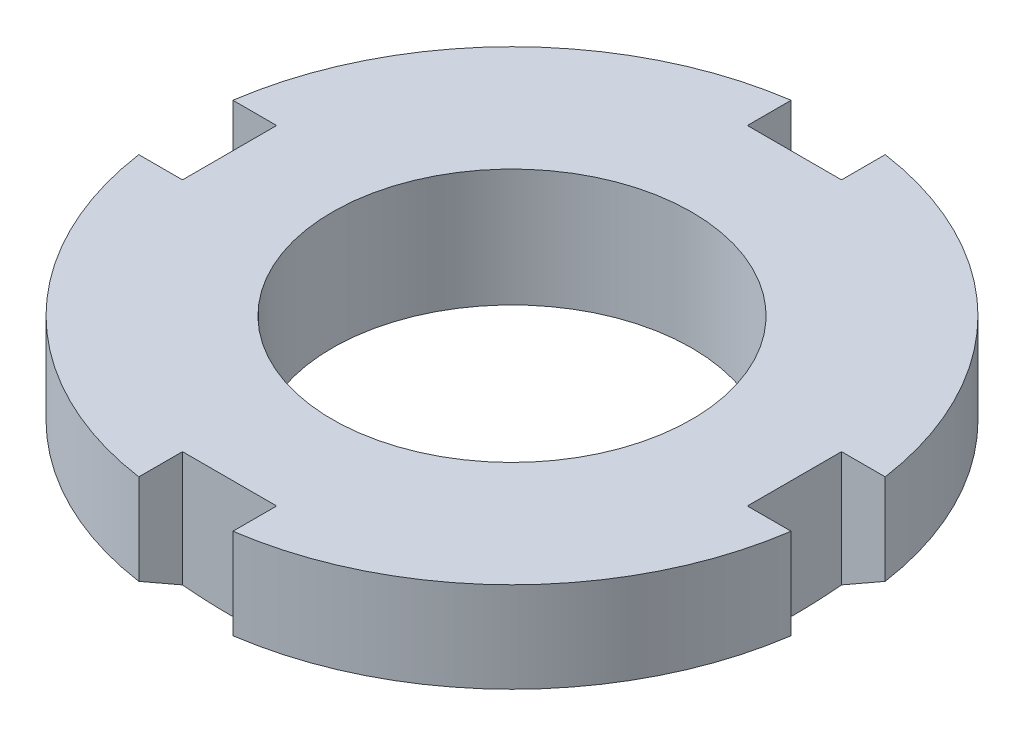
ISO-10303-21;
HEADER;
FILE_DESCRIPTION(('STEP AP214'),'2;1');
FILE_NAME('part.step','',(''),(''),'','','');
FILE_SCHEMA(('AUTOMOTIVE_DESIGN { 1 0 10303 214 1 1 1 1 }'));
ENDSEC;
DATA;
#1=APPLICATION_CONTEXT('core data for automotive mechanical design processes');
#2=APPLICATION_PROTOCOL_DEFINITION('international standard','automotive_design',2000,#1);
#3=PRODUCT_CONTEXT('',#1,'mechanical');
#4=PRODUCT('Part','Part','',(#3));
#5=PRODUCT_RELATED_PRODUCT_CATEGORY('part','',(#4));
#6=PRODUCT_DEFINITION_FORMATION('','',#4);
#7=PRODUCT_DEFINITION_CONTEXT('part definition',#1,'design');
#8=PRODUCT_DEFINITION('design','',#6,#7);
#9=PRODUCT_DEFINITION_SHAPE('','',#8);
#10=(LENGTH_UNIT() NAMED_UNIT(*) SI_UNIT(.MILLI.,.METRE.));
#11=(NAMED_UNIT(*) PLANE_ANGLE_UNIT() SI_UNIT($,.RADIAN.));
#12=(NAMED_UNIT(*) SI_UNIT($,.STERADIAN.) SOLID_ANGLE_UNIT());
#13=UNCERTAINTY_MEASURE_WITH_UNIT(LENGTH_MEASURE(1.E-05),#10,'distance_accuracy_value','');
#14=(GEOMETRIC_REPRESENTATION_CONTEXT(3) GLOBAL_UNCERTAINTY_ASSIGNED_CONTEXT((#13)) GLOBAL_UNIT_ASSIGNED_CONTEXT((#10,
#11,#12)) REPRESENTATION_CONTEXT('',''));
#15=CARTESIAN_POINT('',(0.,0.,0.));
#16=DIRECTION('',(0.,0.,1.));
#17=DIRECTION('',(1.,0.,0.));
#18=AXIS2_PLACEMENT_3D('',#15,#16,#17);
#19=CARTESIAN_POINT('',(7.63397459621556,5.,0.));
#20=DIRECTION('',(0.,1.,0.));
#21=DIRECTION('',(0.,0.,1.));
#22=AXIS2_PLACEMENT_3D('',#19,#20,#21);
#23=PLANE('',#22);
#24=CARTESIAN_POINT('',(0.,5.,0.));
#25=DIRECTION('',(0.,-1.,0.));
#26=DIRECTION('',(0.,0.,-1.));
#27=AXIS2_PLACEMENT_3D('',#24,#25,#26);
#28=CIRCLE('',#27,7.63397459621556);
#29=CARTESIAN_POINT('',(0.,5.,-7.63397459621556));
#30=VERTEX_POINT('',#29);
#31=EDGE_CURVE('E354',#30,#30,#28,.T.);
#32=ORIENTED_EDGE('',*,*,#31,.T.);
#33=EDGE_LOOP('',(#32));
#34=FACE_BOUND('',#33,.T.);
#35=CARTESIAN_POINT('',(0.,5.,0.));
#36=DIRECTION('',(0.,-1.,0.));
#37=DIRECTION('',(0.,0.,-1.));
#38=AXIS2_PLACEMENT_3D('',#35,#36,#37);
#39=CIRCLE('',#38,14.);
#40=CARTESIAN_POINT('',(13.856406460551,5.,2.));
#41=VERTEX_POINT('',#40);
#42=CARTESIAN_POINT('',(2.,5.,13.856406460551));
#43=VERTEX_POINT('',#42);
#44=EDGE_CURVE('E182',#41,#43,#39,.T.);
#45=ORIENTED_EDGE('',*,*,#44,.F.);
#46=DIRECTION('',(-1.,0.,0.));
#47=VECTOR('',#46,1.);
#48=CARTESIAN_POINT('',(14.,5.,2.));
#49=LINE('',#48,#47);
#50=CARTESIAN_POINT('',(12.,5.,2.));
#51=VERTEX_POINT('',#50);
#52=EDGE_CURVE('E167',#41,#51,#49,.T.);
#53=ORIENTED_EDGE('',*,*,#52,.T.);
#54=DIRECTION('',(0.,0.,-1.));
#55=VECTOR('',#54,1.);
#56=CARTESIAN_POINT('',(12.,5.,2.));
#57=LINE('',#56,#55);
#58=CARTESIAN_POINT('',(12.,5.,-2.));
#59=VERTEX_POINT('',#58);
#60=EDGE_CURVE('E174',#51,#59,#57,.T.);
#61=ORIENTED_EDGE('',*,*,#60,.T.);
#62=DIRECTION('',(1.,0.,0.));
#63=VECTOR('',#62,1.);
#64=CARTESIAN_POINT('',(14.,5.,-2.));
#65=LINE('',#64,#63);
#66=CARTESIAN_POINT('',(13.856406460551,5.,-2.));
#67=VERTEX_POINT('',#66);
#68=EDGE_CURVE('E178',#59,#67,#65,.T.);
#69=ORIENTED_EDGE('',*,*,#68,.T.);
#70=CARTESIAN_POINT('',(2.,5.,-13.856406460551));
#71=VERTEX_POINT('',#70);
#72=EDGE_CURVE('E251',#71,#67,#39,.T.);
#73=ORIENTED_EDGE('',*,*,#72,.F.);
#74=DIRECTION('',(0.,0.,1.));
#75=VECTOR('',#74,1.);
#76=CARTESIAN_POINT('',(2.,5.,-14.));
#77=LINE('',#76,#75);
#78=CARTESIAN_POINT('',(2.,5.,-12.));
#79=VERTEX_POINT('',#78);
#80=EDGE_CURVE('E425',#71,#79,#77,.T.);
#81=ORIENTED_EDGE('',*,*,#80,.T.);
#82=DIRECTION('',(-1.,0.,0.));
#83=VECTOR('',#82,1.);
#84=CARTESIAN_POINT('',(2.,5.,-12.));
#85=LINE('',#84,#83);
#86=CARTESIAN_POINT('',(-2.,5.,-12.));
#87=VERTEX_POINT('',#86);
#88=EDGE_CURVE('E428',#79,#87,#85,.T.);
#89=ORIENTED_EDGE('',*,*,#88,.T.);
#90=DIRECTION('',(0.,0.,-1.));
#91=VECTOR('',#90,1.);
#92=CARTESIAN_POINT('',(-2.,5.,-14.));
#93=LINE('',#92,#91);
#94=CARTESIAN_POINT('',(-2.,5.,-13.856406460551));
#95=VERTEX_POINT('',#94);
#96=EDGE_CURVE('E431',#87,#95,#93,.T.);
#97=ORIENTED_EDGE('',*,*,#96,.T.);
#98=CARTESIAN_POINT('',(-13.856406460551,5.,-2.));
#99=VERTEX_POINT('',#98);
#100=EDGE_CURVE('E351',#99,#95,#39,.T.);
#101=ORIENTED_EDGE('',*,*,#100,.F.);
#102=DIRECTION('',(1.,0.,0.));
#103=VECTOR('',#102,1.);
#104=CARTESIAN_POINT('',(-14.,5.,-2.));
#105=LINE('',#104,#103);
#106=CARTESIAN_POINT('',(-12.,5.,-2.));
#107=VERTEX_POINT('',#106);
#108=EDGE_CURVE('E262',#99,#107,#105,.T.);
#109=ORIENTED_EDGE('',*,*,#108,.T.);
#110=DIRECTION('',(0.,0.,1.));
#111=VECTOR('',#110,1.);
#112=CARTESIAN_POINT('',(-12.,5.,2.));
#113=LINE('',#112,#111);
#114=CARTESIAN_POINT('',(-12.,5.,2.));
#115=VERTEX_POINT('',#114);
#116=EDGE_CURVE('E253',#107,#115,#113,.T.);
#117=ORIENTED_EDGE('',*,*,#116,.T.);
#118=DIRECTION('',(-1.,0.,0.));
#119=VECTOR('',#118,1.);
#120=CARTESIAN_POINT('',(-14.,5.,2.));
#121=LINE('',#120,#119);
#122=CARTESIAN_POINT('',(-13.856406460551,5.,2.));
#123=VERTEX_POINT('',#122);
#124=EDGE_CURVE('E257',#115,#123,#121,.T.);
#125=ORIENTED_EDGE('',*,*,#124,.T.);
#126=CARTESIAN_POINT('',(-2.,5.,13.856406460551));
#127=VERTEX_POINT('',#126);
#128=EDGE_CURVE('E345',#127,#123,#39,.T.);
#129=ORIENTED_EDGE('',*,*,#128,.F.);
#130=DIRECTION('',(0.,0.,-1.));
#131=VECTOR('',#130,1.);
#132=CARTESIAN_POINT('',(-2.,5.,14.));
#133=LINE('',#132,#131);
#134=CARTESIAN_POINT('',(-2.,5.,12.));
#135=VERTEX_POINT('',#134);
#136=EDGE_CURVE('E441',#127,#135,#133,.T.);
#137=ORIENTED_EDGE('',*,*,#136,.T.);
#138=DIRECTION('',(1.,0.,0.));
#139=VECTOR('',#138,1.);
#140=CARTESIAN_POINT('',(2.,5.,12.));
#141=LINE('',#140,#139);
#142=CARTESIAN_POINT('',(2.,5.,12.));
#143=VERTEX_POINT('',#142);
#144=EDGE_CURVE('E409',#135,#143,#141,.T.);
#145=ORIENTED_EDGE('',*,*,#144,.T.);
#146=DIRECTION('',(0.,0.,1.));
#147=VECTOR('',#146,1.);
#148=CARTESIAN_POINT('',(2.,5.,14.));
#149=LINE('',#148,#147);
#150=EDGE_CURVE('E414',#143,#43,#149,.T.);
#151=ORIENTED_EDGE('',*,*,#150,.T.);
#152=EDGE_LOOP('',(#45,#53,#61,#69,#73,#81,#89,#97,#101,#109,#117,#125,#129,#137,#145,#151));
#153=FACE_BOUND('',#152,.T.);
#154=ADVANCED_FACE('F34',(#34,#153),#23,.T.);
#155=CARTESIAN_POINT('',(0.,0.,0.));
#156=DIRECTION('',(0.,-1.,0.));
#157=DIRECTION('',(0.,0.,-1.));
#158=AXIS2_PLACEMENT_3D('',#155,#156,#157);
#159=CYLINDRICAL_SURFACE('',#158,14.);
#160=CARTESIAN_POINT('',(0.,1.15470053837924,0.));
#161=DIRECTION('',(0.,-1.,0.));
#162=DIRECTION('',(0.,0.,-1.));
#163=AXIS2_PLACEMENT_3D('',#160,#161,#162);
#164=CIRCLE('',#163,14.);
#165=CARTESIAN_POINT('',(13.856406460551,1.15470053837924,2.));
#166=VERTEX_POINT('',#165);
#167=CARTESIAN_POINT('',(2.,1.15470053837924,13.856406460551));
#168=VERTEX_POINT('',#167);
#169=EDGE_CURVE('E391',#166,#168,#164,.T.);
#170=ORIENTED_EDGE('',*,*,#169,.F.);
#171=DIRECTION('',(0.,-1.,0.));
#172=VECTOR('',#171,1.);
#173=CARTESIAN_POINT('',(13.856406460551,0.,2.));
#174=LINE('',#173,#172);
#175=EDGE_CURVE('E252',#166,#41,#174,.F.);
#176=ORIENTED_EDGE('',*,*,#175,.T.);
#177=ORIENTED_EDGE('',*,*,#44,.T.);
#178=DIRECTION('',(0.,-1.,0.));
#179=VECTOR('',#178,1.);
#180=CARTESIAN_POINT('',(2.,0.,13.856406460551));
#181=LINE('',#180,#179);
#182=EDGE_CURVE('E421',#43,#168,#181,.T.);
#183=ORIENTED_EDGE('',*,*,#182,.T.);
#184=EDGE_LOOP('',(#170,#176,#177,#183));
#185=FACE_BOUND('',#184,.T.);
#186=ADVANCED_FACE('F325',(#185),#159,.T.);
#187=ORIENTED_EDGE('',*,*,#72,.T.);
#188=DIRECTION('',(0.,-1.,0.));
#189=VECTOR('',#188,1.);
#190=CARTESIAN_POINT('',(13.856406460551,0.,-2.));
#191=LINE('',#190,#189);
#192=CARTESIAN_POINT('',(13.856406460551,1.15470053837924,-2.));
#193=VERTEX_POINT('',#192);
#194=EDGE_CURVE('E193',#67,#193,#191,.T.);
#195=ORIENTED_EDGE('',*,*,#194,.T.);
#196=CARTESIAN_POINT('',(2.,1.15470053837924,-13.856406460551));
#197=VERTEX_POINT('',#196);
#198=EDGE_CURVE('E244',#197,#193,#164,.T.);
#199=ORIENTED_EDGE('',*,*,#198,.F.);
#200=DIRECTION('',(0.,-1.,0.));
#201=VECTOR('',#200,1.);
#202=CARTESIAN_POINT('',(2.,0.,-13.856406460551));
#203=LINE('',#202,#201);
#204=EDGE_CURVE('E374',#197,#71,#203,.F.);
#205=ORIENTED_EDGE('',*,*,#204,.T.);
#206=EDGE_LOOP('',(#187,#195,#199,#205));
#207=FACE_BOUND('',#206,.T.);
#208=ADVANCED_FACE('F248',(#207),#159,.T.);
#209=CARTESIAN_POINT('',(0.,0.,0.));
#210=DIRECTION('',(0.,1.,0.));
#211=DIRECTION('',(0.,0.,1.));
#212=AXIS2_PLACEMENT_3D('',#209,#210,#211);
#213=CONICAL_SURFACE('',#212,12.,1.0471975511966);
#214=CARTESIAN_POINT('',(12.,1.87795299381493,-9.41515599070251));
#215=CARTESIAN_POINT('',(12.,1.76332119906728,-9.09343548288506));
#216=CARTESIAN_POINT('',(12.,1.65186650840926,-8.77055814556342));
#217=CARTESIAN_POINT('',(12.,1.4364057488311,-8.12223353453425));
#218=CARTESIAN_POINT('',(12.,1.33240173786757,-7.7967855781433));
#219=CARTESIAN_POINT('',(12.,1.13265277291363,-7.14209874582814));
#220=CARTESIAN_POINT('',(12.,1.0369379408983,-6.81285059833096));
#221=CARTESIAN_POINT('',(12.,0.855502545840681,-6.15166020977604));
#222=CARTESIAN_POINT('',(12.,0.769781218077795,-5.81971817694108));
#223=CARTESIAN_POINT('',(12.,0.533895256917983,-4.8370326871397));
#224=CARTESIAN_POINT('',(12.,0.399640162599706,-4.18226816257363));
#225=CARTESIAN_POINT('',(12.,0.238903660568225,-3.19408498380255));
#226=CARTESIAN_POINT('',(12.,0.192115948892997,-2.86389520525582));
#227=CARTESIAN_POINT('',(12.,0.113172453974791,-2.20175423274393));
#228=CARTESIAN_POINT('',(12.,0.081015792091243,-1.86980314576238));
#229=CARTESIAN_POINT('',(12.,0.0367602279758807,-1.26660614568036));
#230=CARTESIAN_POINT('',(12.,0.0220435318716486,-0.995549703602742));
#231=CARTESIAN_POINT('',(12.,0.0031737422685835,-0.453047042259345));
#232=CARTESIAN_POINT('',(12.,-0.000978719252027248,-0.181600800646689));
#233=CARTESIAN_POINT('',(12.,0.0013676948717654,0.361432173767583));
#234=CARTESIAN_POINT('',(12.,0.00787393905607969,0.633018873895342));
#235=CARTESIAN_POINT('',(12.,0.0314205055179157,1.17571298398449));
#236=CARTESIAN_POINT('',(12.,0.048460072961549,1.44682042689419));
#237=CARTESIAN_POINT('',(12.,0.0932077772631201,1.99386044313266));
#238=CARTESIAN_POINT('',(12.,0.121131690444464,2.26977527811339));
#239=CARTESIAN_POINT('',(12.,0.187088659223968,2.82040723547428));
#240=CARTESIAN_POINT('',(12.,0.225122424609702,3.09512427238307));
#241=CARTESIAN_POINT('',(12.,0.310597454669185,3.64282065377898));
#242=CARTESIAN_POINT('',(12.,0.358030018270598,3.91580136623978));
#243=CARTESIAN_POINT('',(12.,0.461564207406625,4.46005610524042));
#244=CARTESIAN_POINT('',(12.,0.517663944166892,4.73133049025522));
#245=CARTESIAN_POINT('',(12.,0.577727616734366,5.00169907534265));
#246=B_SPLINE_CURVE_WITH_KNOTS('',3,(#214,#215,#216,#217,#218,#219,#220,#221,#222,#223,#224,
#225,#226,#227,#228,#229,#230,#231,#232,#233,#234,#235,#236,#237,#238,#239,#240,#241,#242,#243,
#244,#245),.UNSPECIFIED.,.F.,.F.,(4,2,2,2,2,2,2,2,2,2,2,2,2,2,2,4),(0.,1.02461389857041,
2.04950972380033,3.07798598133,4.10638348631093,6.10932102665536,7.10952575253202,
8.10967040503776,8.92384466663938,9.73806763298158,10.5528537227241,11.3675814304299,
12.1993571009129,13.0311911837278,13.8622587520693,14.693145466666),.UNSPECIFIED.);
#247=CARTESIAN_POINT('',(12.,0.,0.));
#248=VERTEX_POINT('',#247);
#249=CARTESIAN_POINT('',(12.,0.0955659382929823,2.));
#250=VERTEX_POINT('',#249);
#251=EDGE_CURVE('E171',#248,#250,#246,.T.);
#252=ORIENTED_EDGE('',*,*,#251,.T.);
#253=CARTESIAN_POINT('',(8.32745873802696,-1.98362475031242,2.00000000000001));
#254=CARTESIAN_POINT('',(8.65685179647146,-1.79868810545014,2.00000000000001));
#255=CARTESIAN_POINT('',(8.98600649995912,-1.61332792818694,2.00000000000001));
#256=CARTESIAN_POINT('',(9.6439404159257,-1.24194340776632,2.00000000000001));
#257=CARTESIAN_POINT('',(9.97271962898339,-1.05591906563443,2.00000000000001));
#258=CARTESIAN_POINT('',(10.6300034720404,-0.683389294555139,2.00000000000001));
#259=CARTESIAN_POINT('',(10.9585081031432,-0.496883867553484,2.00000000000001));
#260=CARTESIAN_POINT('',(11.6153045193114,-0.12349831184617,2.));
#261=CARTESIAN_POINT('',(11.943596304282,0.0633818170263234,2.));
#262=CARTESIAN_POINT('',(12.9282249526219,0.624449314050377,2.));
#263=CARTESIAN_POINT('',(13.584317574021,0.999065191325517,2.));
#264=CARTESIAN_POINT('',(14.8960654835435,1.74906807972215,2.));
#265=CARTESIAN_POINT('',(15.5517207699114,2.12445509391446,1.99999999999999));
#266=CARTESIAN_POINT('',(16.2072617623857,2.50004039962872,1.99999999999999));
#267=B_SPLINE_CURVE_WITH_KNOTS('',3,(#253,#254,#255,#256,#257,#258,#259,#260,#261,#262,#263,
#264,#265,#266),.UNSPECIFIED.,.F.,.F.,(4,2,2,2,2,2,4),(0.,1.13327394855531,2.26654614797927,
3.39981377104527,4.53308189880642,6.7996096528127,9.06614645016141),.UNSPECIFIED.);
#268=EDGE_CURVE('E11',#250,#166,#267,.T.);
#269=ORIENTED_EDGE('',*,*,#268,.T.);
#270=ORIENTED_EDGE('',*,*,#169,.T.);
#271=CARTESIAN_POINT('',(2.,2.50004039962872,16.2072617623857));
#272=CARTESIAN_POINT('',(2.,2.12445509391446,15.5517207699114));
#273=CARTESIAN_POINT('',(2.,1.74906807972215,14.8960654835435));
#274=CARTESIAN_POINT('',(2.,0.999065191325516,13.584317574021));
#275=CARTESIAN_POINT('',(2.,0.624449314050376,12.9282249526219));
#276=CARTESIAN_POINT('',(2.,0.0633818170263235,11.943596304282));
#277=CARTESIAN_POINT('',(2.,-0.123498311846169,11.6153045193114));
#278=CARTESIAN_POINT('',(2.,-0.496883867553482,10.9585081031432));
#279=CARTESIAN_POINT('',(2.,-0.683389294555137,10.6300034720404));
#280=CARTESIAN_POINT('',(2.,-1.05591906563443,9.9727196289834));
#281=CARTESIAN_POINT('',(2.,-1.24194340776631,9.64394041592571));
#282=CARTESIAN_POINT('',(2.,-1.61332792818694,8.98600649995913));
#283=CARTESIAN_POINT('',(2.,-1.79868810545013,8.65685179647147));
#284=CARTESIAN_POINT('',(2.,-1.98362475031241,8.32745873802697));
#285=B_SPLINE_CURVE_WITH_KNOTS('',3,(#271,#272,#273,#274,#275,#276,#277,#278,#279,#280,#281,
#282,#283,#284),.UNSPECIFIED.,.F.,.F.,(4,2,2,2,2,2,4),(0.,2.26653679734871,4.53306455135499,
5.66633267911613,6.79960030218213,7.9328725016061,9.0661464501614),.UNSPECIFIED.);
#286=CARTESIAN_POINT('',(2.,0.0955659382929835,12.));
#287=VERTEX_POINT('',#286);
#288=EDGE_CURVE('E289',#168,#287,#285,.T.);
#289=ORIENTED_EDGE('',*,*,#288,.T.);
#290=CARTESIAN_POINT('',(5.00169907534265,0.577727616734369,12.));
#291=CARTESIAN_POINT('',(4.73133049025522,0.517663944166894,12.));
#292=CARTESIAN_POINT('',(4.46005610524042,0.461564207406627,12.));
#293=CARTESIAN_POINT('',(3.91580136623979,0.3580300182706,12.));
#294=CARTESIAN_POINT('',(3.64282065377898,0.310597454669188,12.));
#295=CARTESIAN_POINT('',(3.09512427238307,0.225122424609704,12.));
#296=CARTESIAN_POINT('',(2.82040723547428,0.18708865922397,12.));
#297=CARTESIAN_POINT('',(2.26977527811339,0.121131690444466,12.));
#298=CARTESIAN_POINT('',(1.99386044313266,0.0932077772631228,12.));
#299=CARTESIAN_POINT('',(1.44682042689419,0.0484600729615522,12.));
#300=CARTESIAN_POINT('',(1.1757129839845,0.031420505517919,12.));
#301=CARTESIAN_POINT('',(0.633018873895343,0.00787393905608246,12.));
#302=CARTESIAN_POINT('',(0.361432173767585,0.00136769487176756,12.));
#303=CARTESIAN_POINT('',(-0.181600800646687,-0.000978719252025395,12.));
#304=CARTESIAN_POINT('',(-0.453047042259342,0.00317374226858565,12.));
#305=CARTESIAN_POINT('',(-0.995549703602739,0.0220435318716505,12.));
#306=CARTESIAN_POINT('',(-1.26660614568036,0.036760227975882,12.));
#307=CARTESIAN_POINT('',(-1.86980314576237,0.0810157920912444,12.));
#308=CARTESIAN_POINT('',(-2.20175423274392,0.113172453974793,12.));
#309=CARTESIAN_POINT('',(-2.86389520525581,0.192115948892999,12.));
#310=CARTESIAN_POINT('',(-3.19408498380255,0.238903660568226,12.));
#311=CARTESIAN_POINT('',(-4.18226816257363,0.399640162599704,12.));
#312=CARTESIAN_POINT('',(-4.83703268713969,0.533895256917983,12.));
#313=CARTESIAN_POINT('',(-5.81971817694107,0.769781218077794,12.));
#314=CARTESIAN_POINT('',(-6.15166020977603,0.855502545840679,12.));
#315=CARTESIAN_POINT('',(-6.81285059833094,1.0369379408983,12.));
#316=CARTESIAN_POINT('',(-7.14209874582813,1.13265277291363,12.));
#317=CARTESIAN_POINT('',(-7.79678557814329,1.33240173786757,12.));
#318=CARTESIAN_POINT('',(-8.12223353453424,1.4364057488311,12.));
#319=CARTESIAN_POINT('',(-8.7705581455634,1.65186650840926,12.));
#320=CARTESIAN_POINT('',(-9.09343548288504,1.76332119906728,12.));
#321=CARTESIAN_POINT('',(-9.41515599070249,1.87795299381492,12.));
#322=B_SPLINE_CURVE_WITH_KNOTS('',3,(#290,#291,#292,#293,#294,#295,#296,#297,#298,#299,#300,
#301,#302,#303,#304,#305,#306,#307,#308,#309,#310,#311,#312,#313,#314,#315,#316,#317,#318,#319,
#320,#321),.UNSPECIFIED.,.F.,.F.,(4,2,2,2,2,2,2,2,2,2,2,2,2,2,2,4),(0.,0.830886714596724,
1.66195428293824,2.49378836575311,3.32556403623618,4.14029174394192,4.95507783368447,
5.76930080002666,6.58347506162829,7.58361971413402,8.58382444001068,10.5867619803551,
11.615159485336,12.6436357428657,13.6685315680956,14.693145466666),.UNSPECIFIED.);
#323=CARTESIAN_POINT('',(0.,0.,12.));
#324=VERTEX_POINT('',#323);
#325=EDGE_CURVE('E412',#287,#324,#322,.T.);
#326=ORIENTED_EDGE('',*,*,#325,.T.);
#327=CARTESIAN_POINT('',(0.,0.,0.));
#328=DIRECTION('',(0.,-1.,0.));
#329=DIRECTION('',(0.,0.,-1.));
#330=AXIS2_PLACEMENT_3D('',#327,#328,#329);
#331=CIRCLE('',#330,12.);
#332=EDGE_CURVE('E389',#248,#324,#331,.T.);
#333=ORIENTED_EDGE('',*,*,#332,.F.);
#334=EDGE_LOOP('',(#252,#269,#270,#289,#326,#333));
#335=FACE_BOUND('',#334,.T.);
#336=ADVANCED_FACE('F340',(#335),#213,.T.);
#337=CARTESIAN_POINT('',(16.2072617623857,2.50004039962872,-1.99999999999999));
#338=CARTESIAN_POINT('',(15.5517207699114,2.12445509391446,-1.99999999999999));
#339=CARTESIAN_POINT('',(14.8960654835435,1.74906807972215,-1.99999999999999));
#340=CARTESIAN_POINT('',(13.584317574021,0.999065191325516,-2.));
#341=CARTESIAN_POINT('',(12.9282249526219,0.624449314050375,-2.));
#342=CARTESIAN_POINT('',(11.943596304282,0.0633818170263215,-2.));
#343=CARTESIAN_POINT('',(11.6153045193114,-0.123498311846171,-2.));
#344=CARTESIAN_POINT('',(10.9585081031432,-0.496883867553485,-2.));
#345=CARTESIAN_POINT('',(10.6300034720404,-0.68338929455514,-2.));
#346=CARTESIAN_POINT('',(9.97271962898339,-1.05591906563443,-2.00000000000001));
#347=CARTESIAN_POINT('',(9.6439404159257,-1.24194340776632,-2.00000000000001));
#348=CARTESIAN_POINT('',(8.98600649995912,-1.61332792818694,-2.00000000000001));
#349=CARTESIAN_POINT('',(8.65685179647146,-1.79868810545014,-2.00000000000001));
#350=CARTESIAN_POINT('',(8.32745873802696,-1.98362475031242,-2.00000000000001));
#351=B_SPLINE_CURVE_WITH_KNOTS('',3,(#337,#338,#339,#340,#341,#342,#343,#344,#345,#346,#347,
#348,#349,#350),.UNSPECIFIED.,.F.,.F.,(4,2,2,2,2,2,4),(0.,2.26653679734872,4.533064551355,
5.66633267911615,6.79960030218215,7.93287250160611,9.06614645016141),.UNSPECIFIED.);
#352=CARTESIAN_POINT('',(12.,0.0955659382929824,-2.));
#353=VERTEX_POINT('',#352);
#354=EDGE_CURVE('E47',#193,#353,#351,.T.);
#355=ORIENTED_EDGE('',*,*,#354,.T.);
#356=EDGE_CURVE('E192',#353,#248,#246,.T.);
#357=ORIENTED_EDGE('',*,*,#356,.T.);
#358=CARTESIAN_POINT('',(0.,0.,-12.));
#359=VERTEX_POINT('',#358);
#360=EDGE_CURVE('E388',#359,#248,#331,.T.);
#361=ORIENTED_EDGE('',*,*,#360,.F.);
#362=CARTESIAN_POINT('',(-9.4151559907025,1.87795299381492,-12.));
#363=CARTESIAN_POINT('',(-9.09343548288505,1.76332119906728,-12.));
#364=CARTESIAN_POINT('',(-8.77055814556341,1.65186650840926,-12.));
#365=CARTESIAN_POINT('',(-8.12223353453425,1.4364057488311,-12.));
#366=CARTESIAN_POINT('',(-7.7967855781433,1.33240173786757,-12.));
#367=CARTESIAN_POINT('',(-7.14209874582814,1.13265277291363,-12.));
#368=CARTESIAN_POINT('',(-6.81285059833095,1.0369379408983,-12.));
#369=CARTESIAN_POINT('',(-6.15166020977603,0.855502545840682,-12.));
#370=CARTESIAN_POINT('',(-5.81971817694108,0.769781218077796,-12.));
#371=CARTESIAN_POINT('',(-4.8370326871397,0.533895256917986,-12.));
#372=CARTESIAN_POINT('',(-4.18226816257363,0.399640162599708,-12.));
#373=CARTESIAN_POINT('',(-3.19408498380255,0.238903660568227,-12.));
#374=CARTESIAN_POINT('',(-2.86389520525582,0.192115948892999,-12.));
#375=CARTESIAN_POINT('',(-2.20175423274393,0.113172453974793,-12.));
#376=CARTESIAN_POINT('',(-1.86980314576238,0.081015792091245,-12.));
#377=CARTESIAN_POINT('',(-1.26660614568036,0.0367602279758827,-12.));
#378=CARTESIAN_POINT('',(-0.995549703602742,0.0220435318716506,-12.));
#379=CARTESIAN_POINT('',(-0.453047042259345,0.0031737422685855,-12.));
#380=CARTESIAN_POINT('',(-0.181600800646689,-0.000978719252025257,-12.));
#381=CARTESIAN_POINT('',(0.361432173767584,0.00136769487176742,-12.));
#382=CARTESIAN_POINT('',(0.633018873895342,0.00787393905608174,-12.));
#383=CARTESIAN_POINT('',(1.17571298398449,0.0314205055179177,-12.));
#384=CARTESIAN_POINT('',(1.44682042689419,0.048460072961551,-12.));
#385=CARTESIAN_POINT('',(1.99386044313266,0.0932077772631221,-12.));
#386=CARTESIAN_POINT('',(2.26977527811339,0.121131690444466,-12.));
#387=CARTESIAN_POINT('',(2.82040723547428,0.18708865922397,-12.));
#388=CARTESIAN_POINT('',(3.09512427238307,0.225122424609704,-12.));
#389=CARTESIAN_POINT('',(3.64282065377898,0.310597454669187,-12.));
#390=CARTESIAN_POINT('',(3.91580136623978,0.3580300182706,-12.));
#391=CARTESIAN_POINT('',(4.46005610524042,0.461564207406627,-12.));
#392=CARTESIAN_POINT('',(4.73133049025522,0.517663944166895,-12.));
#393=CARTESIAN_POINT('',(5.00169907534265,0.577727616734369,-12.));
#394=B_SPLINE_CURVE_WITH_KNOTS('',3,(#362,#363,#364,#365,#366,#367,#368,#369,#370,#371,#372,
#373,#374,#375,#376,#377,#378,#379,#380,#381,#382,#383,#384,#385,#386,#387,#388,#389,#390,#391,
#392,#393),.UNSPECIFIED.,.F.,.F.,(4,2,2,2,2,2,2,2,2,2,2,2,2,2,2,4),(0.,1.02461389857041,
2.04950972380032,3.07798598133,4.10638348631093,6.10932102665535,7.10952575253201,
8.10967040503775,8.92384466663937,9.73806763298157,10.5528537227241,11.3675814304299,
12.1993571009129,13.0311911837278,13.8622587520693,14.693145466666),.UNSPECIFIED.);
#395=CARTESIAN_POINT('',(2.,0.0955659382929836,-12.));
#396=VERTEX_POINT('',#395);
#397=EDGE_CURVE('E378',#359,#396,#394,.T.);
#398=ORIENTED_EDGE('',*,*,#397,.T.);
#399=CARTESIAN_POINT('',(2.,-1.20351332241178,-9.7116540107023));
#400=CARTESIAN_POINT('',(2.,-1.0175621437879,-10.0404733834823));
#401=CARTESIAN_POINT('',(2.,-0.831334716390117,-10.3691362961327));
#402=CARTESIAN_POINT('',(2.,-0.458437603456467,-11.0262108821418));
#403=CARTESIAN_POINT('',(2.,-0.271767918211369,-11.3546225556655));
#404=CARTESIAN_POINT('',(2.,0.288738773251273,-12.3395725523153));
#405=CARTESIAN_POINT('',(2.,0.663074171960786,-12.9958271876286));
#406=CARTESIAN_POINT('',(2.,1.41257640550502,-14.3078598232474));
#407=CARTESIAN_POINT('',(2.,1.78774323904349,-14.9636378242939));
#408=CARTESIAN_POINT('',(2.,2.5386610233939,-16.2748611372164));
#409=CARTESIAN_POINT('',(2.,2.91441197539653,-16.9303064484106));
#410=CARTESIAN_POINT('',(2.,3.29033027005393,-17.5856555377406));
#411=B_SPLINE_CURVE_WITH_KNOTS('',3,(#399,#400,#401,#402,#403,#404,#405,#406,#407,#408,#409,
#410),.UNSPECIFIED.,.F.,.F.,(4,2,2,2,2,4),(0.,1.13326925181469,2.26653775875331,
4.53307016602603,6.79959904214927,9.06613254455054),.UNSPECIFIED.);
#412=EDGE_CURVE('E295',#396,#197,#411,.T.);
#413=ORIENTED_EDGE('',*,*,#412,.T.);
#414=ORIENTED_EDGE('',*,*,#198,.T.);
#415=EDGE_LOOP('',(#355,#357,#361,#398,#413,#414));
#416=FACE_BOUND('',#415,.T.);
#417=ADVANCED_FACE('F239',(#416),#213,.T.);
#418=ORIENTED_EDGE('',*,*,#128,.T.);
#419=DIRECTION('',(0.,-1.,0.));
#420=VECTOR('',#419,1.);
#421=CARTESIAN_POINT('',(-13.856406460551,0.,2.));
#422=LINE('',#421,#420);
#423=CARTESIAN_POINT('',(-13.856406460551,1.15470053837924,2.));
#424=VERTEX_POINT('',#423);
#425=EDGE_CURVE('E347',#123,#424,#422,.T.);
#426=ORIENTED_EDGE('',*,*,#425,.T.);
#427=CARTESIAN_POINT('',(-2.,1.15470053837924,13.856406460551));
#428=VERTEX_POINT('',#427);
#429=EDGE_CURVE('E392',#428,#424,#164,.T.);
#430=ORIENTED_EDGE('',*,*,#429,.F.);
#431=DIRECTION('',(0.,-1.,0.));
#432=VECTOR('',#431,1.);
#433=CARTESIAN_POINT('',(-2.,0.,13.856406460551));
#434=LINE('',#433,#432);
#435=EDGE_CURVE('E349',#428,#127,#434,.F.);
#436=ORIENTED_EDGE('',*,*,#435,.T.);
#437=EDGE_LOOP('',(#418,#426,#430,#436));
#438=FACE_BOUND('',#437,.T.);
#439=ADVANCED_FACE('F330',(#438),#159,.T.);
#440=CARTESIAN_POINT('',(-13.856406460551,1.15470053837924,-2.));
#441=VERTEX_POINT('',#440);
#442=CARTESIAN_POINT('',(-2.,1.15470053837924,-13.856406460551));
#443=VERTEX_POINT('',#442);
#444=EDGE_CURVE('E364',#441,#443,#164,.T.);
#445=ORIENTED_EDGE('',*,*,#444,.F.);
#446=DIRECTION('',(0.,-1.,0.));
#447=VECTOR('',#446,1.);
#448=CARTESIAN_POINT('',(-13.856406460551,0.,-2.));
#449=LINE('',#448,#447);
#450=EDGE_CURVE('E62',#441,#99,#449,.F.);
#451=ORIENTED_EDGE('',*,*,#450,.T.);
#452=ORIENTED_EDGE('',*,*,#100,.T.);
#453=DIRECTION('',(0.,-1.,0.));
#454=VECTOR('',#453,1.);
#455=CARTESIAN_POINT('',(-2.,0.,-13.856406460551));
#456=LINE('',#455,#454);
#457=EDGE_CURVE('E370',#95,#443,#456,.T.);
#458=ORIENTED_EDGE('',*,*,#457,.T.);
#459=EDGE_LOOP('',(#445,#451,#452,#458));
#460=FACE_BOUND('',#459,.T.);
#461=ADVANCED_FACE('F333',(#460),#159,.T.);
#462=ORIENTED_EDGE('',*,*,#429,.T.);
#463=CARTESIAN_POINT('',(-17.5856555377406,3.29033027005393,2.));
#464=CARTESIAN_POINT('',(-16.9303064484106,2.91441197539653,2.));
#465=CARTESIAN_POINT('',(-16.2748611372164,2.5386610233939,2.));
#466=CARTESIAN_POINT('',(-14.9636378242939,1.78774323904349,2.));
#467=CARTESIAN_POINT('',(-14.3078598232474,1.41257640550502,2.));
#468=CARTESIAN_POINT('',(-12.9958271876286,0.663074171960785,2.));
#469=CARTESIAN_POINT('',(-12.3395725523153,0.288738773251272,2.));
#470=CARTESIAN_POINT('',(-11.3546225556655,-0.271767918211371,2.));
#471=CARTESIAN_POINT('',(-11.0262108821418,-0.458437603456469,2.));
#472=CARTESIAN_POINT('',(-10.3691362961327,-0.83133471639012,2.));
#473=CARTESIAN_POINT('',(-10.0404733834823,-1.0175621437879,2.));
#474=CARTESIAN_POINT('',(-9.71165401070229,-1.20351332241178,2.));
#475=B_SPLINE_CURVE_WITH_KNOTS('',3,(#463,#464,#465,#466,#467,#468,#469,#470,#471,#472,#473,
#474),.UNSPECIFIED.,.F.,.F.,(4,2,2,2,2,4),(0.,2.26653350240128,4.53306237852452,
6.79959478579724,7.93286329273586,9.06613254455056),.UNSPECIFIED.);
#476=CARTESIAN_POINT('',(-12.,0.0955659382929816,2.));
#477=VERTEX_POINT('',#476);
#478=EDGE_CURVE('E221',#424,#477,#475,.T.);
#479=ORIENTED_EDGE('',*,*,#478,.T.);
#480=CARTESIAN_POINT('',(-12.,0.577727616734366,5.00169907534265));
#481=CARTESIAN_POINT('',(-12.,0.517663944166893,4.73133049025522));
#482=CARTESIAN_POINT('',(-12.,0.461564207406625,4.46005610524042));
#483=CARTESIAN_POINT('',(-12.,0.358030018270598,3.91580136623978));
#484=CARTESIAN_POINT('',(-12.,0.310597454669185,3.64282065377898));
#485=CARTESIAN_POINT('',(-12.,0.225122424609702,3.09512427238307));
#486=CARTESIAN_POINT('',(-12.,0.187088659223968,2.82040723547428));
#487=CARTESIAN_POINT('',(-12.,0.121131690444464,2.26977527811339));
#488=CARTESIAN_POINT('',(-12.,0.0932077772631201,1.99386044313266));
#489=CARTESIAN_POINT('',(-12.,0.0484600729615489,1.44682042689419));
#490=CARTESIAN_POINT('',(-12.,0.0314205055179157,1.17571298398449));
#491=CARTESIAN_POINT('',(-12.,0.00787393905607975,0.63301887389534));
#492=CARTESIAN_POINT('',(-12.,0.00136769487176544,0.361432173767582));
#493=CARTESIAN_POINT('',(-12.,-0.000978719252027288,-0.18160080064669));
#494=CARTESIAN_POINT('',(-12.,0.0031737422685834,-0.453047042259346));
#495=CARTESIAN_POINT('',(-12.,0.0220435318716487,-0.995549703602742));
#496=CARTESIAN_POINT('',(-12.,0.036760227975881,-1.26660614568036));
#497=CARTESIAN_POINT('',(-12.,0.0810157920912435,-1.86980314576238));
#498=CARTESIAN_POINT('',(-12.,0.113172453974791,-2.20175423274393));
#499=CARTESIAN_POINT('',(-12.,0.192115948892997,-2.86389520525582));
#500=CARTESIAN_POINT('',(-12.,0.238903660568225,-3.19408498380255));
#501=CARTESIAN_POINT('',(-12.,0.399640162599705,-4.18226816257363));
#502=CARTESIAN_POINT('',(-12.,0.533895256917984,-4.8370326871397));
#503=CARTESIAN_POINT('',(-12.,0.769781218077795,-5.81971817694108));
#504=CARTESIAN_POINT('',(-12.,0.855502545840681,-6.15166020977604));
#505=CARTESIAN_POINT('',(-12.,1.0369379408983,-6.81285059833095));
#506=CARTESIAN_POINT('',(-12.,1.13265277291363,-7.14209874582814));
#507=CARTESIAN_POINT('',(-12.,1.33240173786757,-7.7967855781433));
#508=CARTESIAN_POINT('',(-12.,1.4364057488311,-8.12223353453425));
#509=CARTESIAN_POINT('',(-12.,1.65186650840926,-8.77055814556341));
#510=CARTESIAN_POINT('',(-12.,1.76332119906728,-9.09343548288505));
#511=CARTESIAN_POINT('',(-12.,1.87795299381492,-9.4151559907025));
#512=B_SPLINE_CURVE_WITH_KNOTS('',3,(#480,#481,#482,#483,#484,#485,#486,#487,#488,#489,#490,
#491,#492,#493,#494,#495,#496,#497,#498,#499,#500,#501,#502,#503,#504,#505,#506,#507,#508,#509,
#510,#511),.UNSPECIFIED.,.F.,.F.,(4,2,2,2,2,2,2,2,2,2,2,2,2,2,2,4),(0.,0.830886714596724,
1.66195428293824,2.49378836575311,3.32556403623617,4.14029174394192,4.95507783368447,
5.76930080002666,6.58347506162828,7.58361971413402,8.58382444001068,10.5867619803551,
11.615159485336,12.6436357428657,13.6685315680956,14.693145466666),.UNSPECIFIED.);
#513=CARTESIAN_POINT('',(-12.,0.,0.));
#514=VERTEX_POINT('',#513);
#515=EDGE_CURVE('E275',#477,#514,#512,.T.);
#516=ORIENTED_EDGE('',*,*,#515,.T.);
#517=EDGE_CURVE('E390',#324,#514,#331,.T.);
#518=ORIENTED_EDGE('',*,*,#517,.F.);
#519=CARTESIAN_POINT('',(-2.,0.0955659382929836,12.));
#520=VERTEX_POINT('',#519);
#521=EDGE_CURVE('E399',#324,#520,#322,.T.);
#522=ORIENTED_EDGE('',*,*,#521,.T.);
#523=CARTESIAN_POINT('',(-2.,-1.98362475031241,8.32745873802697));
#524=CARTESIAN_POINT('',(-2.,-1.79868810545014,8.65685179647147));
#525=CARTESIAN_POINT('',(-2.,-1.61332792818694,8.98600649995913));
#526=CARTESIAN_POINT('',(-2.,-1.24194340776632,9.64394041592571));
#527=CARTESIAN_POINT('',(-2.,-1.05591906563443,9.9727196289834));
#528=CARTESIAN_POINT('',(-2.,-0.683389294555137,10.6300034720404));
#529=CARTESIAN_POINT('',(-2.,-0.496883867553483,10.9585081031432));
#530=CARTESIAN_POINT('',(-2.,-0.123498311846171,11.6153045193114));
#531=CARTESIAN_POINT('',(-2.,0.0633818170263227,11.943596304282));
#532=CARTESIAN_POINT('',(-2.,0.624449314050376,12.9282249526219));
#533=CARTESIAN_POINT('',(-2.,0.999065191325516,13.584317574021));
#534=CARTESIAN_POINT('',(-2.,1.74906807972215,14.8960654835435));
#535=CARTESIAN_POINT('',(-2.,2.12445509391446,15.5517207699114));
#536=CARTESIAN_POINT('',(-2.,2.50004039962872,16.2072617623857));
#537=B_SPLINE_CURVE_WITH_KNOTS('',3,(#523,#524,#525,#526,#527,#528,#529,#530,#531,#532,#533,
#534,#535,#536),.UNSPECIFIED.,.F.,.F.,(4,2,2,2,2,2,4),(0.,1.1332739485553,2.26654614797926,
3.39981377104526,4.53308189880641,6.79960965281268,9.0661464501614),.UNSPECIFIED.);
#538=EDGE_CURVE('E222',#520,#428,#537,.T.);
#539=ORIENTED_EDGE('',*,*,#538,.T.);
#540=EDGE_LOOP('',(#462,#479,#516,#518,#522,#539));
#541=FACE_BOUND('',#540,.T.);
#542=ADVANCED_FACE('F195',(#541),#213,.T.);
#543=EDGE_CURVE('E387',#514,#359,#331,.T.);
#544=ORIENTED_EDGE('',*,*,#543,.F.);
#545=CARTESIAN_POINT('',(-12.,0.0955659382929823,-2.));
#546=VERTEX_POINT('',#545);
#547=EDGE_CURVE('E269',#514,#546,#512,.T.);
#548=ORIENTED_EDGE('',*,*,#547,.T.);
#549=CARTESIAN_POINT('',(-9.71165401070229,-1.20351332241178,-2.));
#550=CARTESIAN_POINT('',(-10.0404733834823,-1.0175621437879,-2.));
#551=CARTESIAN_POINT('',(-10.3691362961327,-0.83133471639012,-2.));
#552=CARTESIAN_POINT('',(-11.0262108821418,-0.458437603456469,-2.));
#553=CARTESIAN_POINT('',(-11.3546225556655,-0.27176791821137,-2.));
#554=CARTESIAN_POINT('',(-12.3395725523153,0.288738773251273,-2.));
#555=CARTESIAN_POINT('',(-12.9958271876286,0.663074171960786,-2.));
#556=CARTESIAN_POINT('',(-14.3078598232474,1.41257640550502,-2.));
#557=CARTESIAN_POINT('',(-14.9636378242939,1.78774323904349,-2.));
#558=CARTESIAN_POINT('',(-16.2748611372164,2.5386610233939,-2.));
#559=CARTESIAN_POINT('',(-16.9303064484106,2.91441197539653,-2.));
#560=CARTESIAN_POINT('',(-17.5856555377406,3.29033027005393,-2.));
#561=B_SPLINE_CURVE_WITH_KNOTS('',3,(#549,#550,#551,#552,#553,#554,#555,#556,#557,#558,#559,
#560),.UNSPECIFIED.,.F.,.F.,(4,2,2,2,2,4),(0.,1.13326925181469,2.26653775875332,
4.53307016602604,6.79959904214927,9.06613254455056),.UNSPECIFIED.);
#562=EDGE_CURVE('E215',#546,#441,#561,.T.);
#563=ORIENTED_EDGE('',*,*,#562,.T.);
#564=ORIENTED_EDGE('',*,*,#444,.T.);
#565=CARTESIAN_POINT('',(-2.,3.29033027005393,-17.5856555377406));
#566=CARTESIAN_POINT('',(-2.,2.91441197539653,-16.9303064484106));
#567=CARTESIAN_POINT('',(-2.,2.5386610233939,-16.2748611372164));
#568=CARTESIAN_POINT('',(-2.,1.78774323904349,-14.9636378242939));
#569=CARTESIAN_POINT('',(-2.,1.41257640550502,-14.3078598232474));
#570=CARTESIAN_POINT('',(-2.,0.663074171960786,-12.9958271876286));
#571=CARTESIAN_POINT('',(-2.,0.288738773251273,-12.3395725523153));
#572=CARTESIAN_POINT('',(-2.,-0.271767918211368,-11.3546225556655));
#573=CARTESIAN_POINT('',(-2.,-0.458437603456466,-11.0262108821418));
#574=CARTESIAN_POINT('',(-2.,-0.831334716390117,-10.3691362961327));
#575=CARTESIAN_POINT('',(-2.,-1.0175621437879,-10.0404733834823));
#576=CARTESIAN_POINT('',(-2.,-1.20351332241178,-9.7116540107023));
#577=B_SPLINE_CURVE_WITH_KNOTS('',3,(#565,#566,#567,#568,#569,#570,#571,#572,#573,#574,#575,
#576),.UNSPECIFIED.,.F.,.F.,(4,2,2,2,2,4),(0.,2.26653350240128,4.53306237852451,
6.79959478579723,7.93286329273585,9.06613254455054),.UNSPECIFIED.);
#578=CARTESIAN_POINT('',(-2.,0.0955659382929837,-12.));
#579=VERTEX_POINT('',#578);
#580=EDGE_CURVE('E301',#443,#579,#577,.T.);
#581=ORIENTED_EDGE('',*,*,#580,.T.);
#582=EDGE_CURVE('E362',#579,#359,#394,.T.);
#583=ORIENTED_EDGE('',*,*,#582,.T.);
#584=EDGE_LOOP('',(#544,#548,#563,#564,#581,#583));
#585=FACE_BOUND('',#584,.T.);
#586=ADVANCED_FACE('F320',(#585),#213,.T.);
#587=CARTESIAN_POINT('',(0.,0.,0.));
#588=DIRECTION('',(0.,-1.,0.));
#589=DIRECTION('',(0.,0.,-1.));
#590=AXIS2_PLACEMENT_3D('',#587,#588,#589);
#591=CYLINDRICAL_SURFACE('',#590,7.63397459621556);
#592=CARTESIAN_POINT('',(0.,0.,0.));
#593=DIRECTION('',(0.,-1.,0.));
#594=DIRECTION('',(0.,0.,-1.));
#595=AXIS2_PLACEMENT_3D('',#592,#593,#594);
#596=CIRCLE('',#595,7.63397459621556);
#597=CARTESIAN_POINT('',(0.,0.,-7.63397459621556));
#598=VERTEX_POINT('',#597);
#599=EDGE_CURVE('E376',#598,#598,#596,.T.);
#600=ORIENTED_EDGE('',*,*,#599,.T.);
#601=EDGE_LOOP('',(#600));
#602=FACE_BOUND('',#601,.T.);
#603=ORIENTED_EDGE('',*,*,#31,.F.);
#604=EDGE_LOOP('',(#603));
#605=FACE_BOUND('',#604,.T.);
#606=ADVANCED_FACE('F36',(#602,#605),#591,.F.);
#607=CARTESIAN_POINT('',(12.,0.,0.));
#608=DIRECTION('',(0.,-1.,0.));
#609=DIRECTION('',(0.,0.,-1.));
#610=AXIS2_PLACEMENT_3D('',#607,#608,#609);
#611=PLANE('',#610);
#612=ORIENTED_EDGE('',*,*,#360,.T.);
#613=ORIENTED_EDGE('',*,*,#332,.T.);
#614=ORIENTED_EDGE('',*,*,#517,.T.);
#615=ORIENTED_EDGE('',*,*,#543,.T.);
#616=EDGE_LOOP('',(#612,#613,#614,#615));
#617=FACE_BOUND('',#616,.T.);
#618=ORIENTED_EDGE('',*,*,#599,.F.);
#619=EDGE_LOOP('',(#618));
#620=FACE_BOUND('',#619,.T.);
#621=ADVANCED_FACE('F312',(#617,#620),#611,.T.);
#622=CARTESIAN_POINT('',(2.,0.,-14.));
#623=DIRECTION('',(-1.,0.,0.));
#624=DIRECTION('',(0.,0.,1.));
#625=AXIS2_PLACEMENT_3D('',#622,#623,#624);
#626=PLANE('',#625);
#627=ORIENTED_EDGE('',*,*,#412,.F.);
#628=DIRECTION('',(0.,1.,0.));
#629=VECTOR('',#628,1.);
#630=CARTESIAN_POINT('',(2.,0.,-12.));
#631=LINE('',#630,#629);
#632=EDGE_CURVE('E433',#396,#79,#631,.T.);
#633=ORIENTED_EDGE('',*,*,#632,.T.);
#634=ORIENTED_EDGE('',*,*,#80,.F.);
#635=ORIENTED_EDGE('',*,*,#204,.F.);
#636=EDGE_LOOP('',(#627,#633,#634,#635));
#637=FACE_BOUND('',#636,.T.);
#638=ADVANCED_FACE('F307',(#637),#626,.T.);
#639=CARTESIAN_POINT('',(2.,0.,-12.));
#640=DIRECTION('',(0.,0.,-1.));
#641=DIRECTION('',(-1.,0.,0.));
#642=AXIS2_PLACEMENT_3D('',#639,#640,#641);
#643=PLANE('',#642);
#644=DIRECTION('',(0.,1.,0.));
#645=VECTOR('',#644,1.);
#646=CARTESIAN_POINT('',(-2.,0.,-12.));
#647=LINE('',#646,#645);
#648=EDGE_CURVE('E372',#579,#87,#647,.T.);
#649=ORIENTED_EDGE('',*,*,#648,.T.);
#650=ORIENTED_EDGE('',*,*,#88,.F.);
#651=ORIENTED_EDGE('',*,*,#632,.F.);
#652=ORIENTED_EDGE('',*,*,#397,.F.);
#653=ORIENTED_EDGE('',*,*,#582,.F.);
#654=EDGE_LOOP('',(#649,#650,#651,#652,#653));
#655=FACE_BOUND('',#654,.T.);
#656=ADVANCED_FACE('F311',(#655),#643,.T.);
#657=CARTESIAN_POINT('',(-2.,0.,-14.));
#658=DIRECTION('',(1.,0.,0.));
#659=DIRECTION('',(0.,0.,-1.));
#660=AXIS2_PLACEMENT_3D('',#657,#658,#659);
#661=PLANE('',#660);
#662=ORIENTED_EDGE('',*,*,#96,.F.);
#663=ORIENTED_EDGE('',*,*,#648,.F.);
#664=ORIENTED_EDGE('',*,*,#580,.F.);
#665=ORIENTED_EDGE('',*,*,#457,.F.);
#666=EDGE_LOOP('',(#662,#663,#664,#665));
#667=FACE_BOUND('',#666,.T.);
#668=ADVANCED_FACE('F369',(#667),#661,.T.);
#669=CARTESIAN_POINT('',(-2.,0.,14.));
#670=DIRECTION('',(1.,0.,0.));
#671=DIRECTION('',(0.,0.,-1.));
#672=AXIS2_PLACEMENT_3D('',#669,#670,#671);
#673=PLANE('',#672);
#674=ORIENTED_EDGE('',*,*,#538,.F.);
#675=DIRECTION('',(0.,1.,0.));
#676=VECTOR('',#675,1.);
#677=CARTESIAN_POINT('',(-2.,0.,12.));
#678=LINE('',#677,#676);
#679=EDGE_CURVE('E403',#520,#135,#678,.T.);
#680=ORIENTED_EDGE('',*,*,#679,.T.);
#681=ORIENTED_EDGE('',*,*,#136,.F.);
#682=ORIENTED_EDGE('',*,*,#435,.F.);
#683=EDGE_LOOP('',(#674,#680,#681,#682));
#684=FACE_BOUND('',#683,.T.);
#685=ADVANCED_FACE('F402',(#684),#673,.T.);
#686=CARTESIAN_POINT('',(2.,0.,12.));
#687=DIRECTION('',(0.,0.,1.));
#688=DIRECTION('',(1.,0.,0.));
#689=AXIS2_PLACEMENT_3D('',#686,#687,#688);
#690=PLANE('',#689);
#691=DIRECTION('',(0.,1.,0.));
#692=VECTOR('',#691,1.);
#693=CARTESIAN_POINT('',(2.,0.,12.));
#694=LINE('',#693,#692);
#695=EDGE_CURVE('E410',#287,#143,#694,.T.);
#696=ORIENTED_EDGE('',*,*,#695,.T.);
#697=ORIENTED_EDGE('',*,*,#144,.F.);
#698=ORIENTED_EDGE('',*,*,#679,.F.);
#699=ORIENTED_EDGE('',*,*,#521,.F.);
#700=ORIENTED_EDGE('',*,*,#325,.F.);
#701=EDGE_LOOP('',(#696,#697,#698,#699,#700));
#702=FACE_BOUND('',#701,.T.);
#703=ADVANCED_FACE('F286',(#702),#690,.T.);
#704=CARTESIAN_POINT('',(2.,0.,14.));
#705=DIRECTION('',(-1.,0.,0.));
#706=DIRECTION('',(0.,0.,1.));
#707=AXIS2_PLACEMENT_3D('',#704,#705,#706);
#708=PLANE('',#707);
#709=ORIENTED_EDGE('',*,*,#150,.F.);
#710=ORIENTED_EDGE('',*,*,#695,.F.);
#711=ORIENTED_EDGE('',*,*,#288,.F.);
#712=ORIENTED_EDGE('',*,*,#182,.F.);
#713=EDGE_LOOP('',(#709,#710,#711,#712));
#714=FACE_BOUND('',#713,.T.);
#715=ADVANCED_FACE('F281',(#714),#708,.T.);
#716=CARTESIAN_POINT('',(-12.,0.,2.));
#717=DIRECTION('',(-1.,0.,0.));
#718=DIRECTION('',(0.,0.,1.));
#719=AXIS2_PLACEMENT_3D('',#716,#717,#718);
#720=PLANE('',#719);
#721=DIRECTION('',(0.,1.,0.));
#722=VECTOR('',#721,1.);
#723=CARTESIAN_POINT('',(-12.,0.,2.));
#724=LINE('',#723,#722);
#725=EDGE_CURVE('E267',#477,#115,#724,.T.);
#726=ORIENTED_EDGE('',*,*,#725,.T.);
#727=ORIENTED_EDGE('',*,*,#116,.F.);
#728=DIRECTION('',(0.,1.,0.));
#729=VECTOR('',#728,1.);
#730=CARTESIAN_POINT('',(-12.,0.,-2.));
#731=LINE('',#730,#729);
#732=EDGE_CURVE('E265',#546,#107,#731,.T.);
#733=ORIENTED_EDGE('',*,*,#732,.F.);
#734=ORIENTED_EDGE('',*,*,#547,.F.);
#735=ORIENTED_EDGE('',*,*,#515,.F.);
#736=EDGE_LOOP('',(#726,#727,#733,#734,#735));
#737=FACE_BOUND('',#736,.T.);
#738=ADVANCED_FACE('F277',(#737),#720,.T.);
#739=CARTESIAN_POINT('',(-14.,0.,2.));
#740=DIRECTION('',(0.,0.,-1.));
#741=DIRECTION('',(-1.,0.,0.));
#742=AXIS2_PLACEMENT_3D('',#739,#740,#741);
#743=PLANE('',#742);
#744=ORIENTED_EDGE('',*,*,#124,.F.);
#745=ORIENTED_EDGE('',*,*,#725,.F.);
#746=ORIENTED_EDGE('',*,*,#478,.F.);
#747=ORIENTED_EDGE('',*,*,#425,.F.);
#748=EDGE_LOOP('',(#744,#745,#746,#747));
#749=FACE_BOUND('',#748,.T.);
#750=ADVANCED_FACE('F211',(#749),#743,.T.);
#751=CARTESIAN_POINT('',(-14.,0.,-2.));
#752=DIRECTION('',(0.,0.,1.));
#753=DIRECTION('',(1.,0.,0.));
#754=AXIS2_PLACEMENT_3D('',#751,#752,#753);
#755=PLANE('',#754);
#756=ORIENTED_EDGE('',*,*,#562,.F.);
#757=ORIENTED_EDGE('',*,*,#732,.T.);
#758=ORIENTED_EDGE('',*,*,#108,.F.);
#759=ORIENTED_EDGE('',*,*,#450,.F.);
#760=EDGE_LOOP('',(#756,#757,#758,#759));
#761=FACE_BOUND('',#760,.T.);
#762=ADVANCED_FACE('F207',(#761),#755,.T.);
#763=CARTESIAN_POINT('',(14.,0.,2.));
#764=DIRECTION('',(0.,0.,-1.));
#765=DIRECTION('',(-1.,0.,0.));
#766=AXIS2_PLACEMENT_3D('',#763,#764,#765);
#767=PLANE('',#766);
#768=ORIENTED_EDGE('',*,*,#268,.F.);
#769=DIRECTION('',(0.,1.,0.));
#770=VECTOR('',#769,1.);
#771=CARTESIAN_POINT('',(12.,0.,2.));
#772=LINE('',#771,#770);
#773=EDGE_CURVE('E163',#250,#51,#772,.T.);
#774=ORIENTED_EDGE('',*,*,#773,.T.);
#775=ORIENTED_EDGE('',*,*,#52,.F.);
#776=ORIENTED_EDGE('',*,*,#175,.F.);
#777=EDGE_LOOP('',(#768,#774,#775,#776));
#778=FACE_BOUND('',#777,.T.);
#779=ADVANCED_FACE('F165',(#778),#767,.T.);
#780=CARTESIAN_POINT('',(12.,0.,2.));
#781=DIRECTION('',(1.,0.,0.));
#782=DIRECTION('',(0.,0.,-1.));
#783=AXIS2_PLACEMENT_3D('',#780,#781,#782);
#784=PLANE('',#783);
#785=DIRECTION('',(0.,1.,0.));
#786=VECTOR('',#785,1.);
#787=CARTESIAN_POINT('',(12.,0.,-2.));
#788=LINE('',#787,#786);
#789=EDGE_CURVE('E54',#353,#59,#788,.T.);
#790=ORIENTED_EDGE('',*,*,#789,.T.);
#791=ORIENTED_EDGE('',*,*,#60,.F.);
#792=ORIENTED_EDGE('',*,*,#773,.F.);
#793=ORIENTED_EDGE('',*,*,#251,.F.);
#794=ORIENTED_EDGE('',*,*,#356,.F.);
#795=EDGE_LOOP('',(#790,#791,#792,#793,#794));
#796=FACE_BOUND('',#795,.T.);
#797=ADVANCED_FACE('F175',(#796),#784,.T.);
#798=CARTESIAN_POINT('',(14.,0.,-2.));
#799=DIRECTION('',(0.,0.,1.));
#800=DIRECTION('',(1.,0.,0.));
#801=AXIS2_PLACEMENT_3D('',#798,#799,#800);
#802=PLANE('',#801);
#803=ORIENTED_EDGE('',*,*,#68,.F.);
#804=ORIENTED_EDGE('',*,*,#789,.F.);
#805=ORIENTED_EDGE('',*,*,#354,.F.);
#806=ORIENTED_EDGE('',*,*,#194,.F.);
#807=EDGE_LOOP('',(#803,#804,#805,#806));
#808=FACE_BOUND('',#807,.T.);
#809=ADVANCED_FACE('F202',(#808),#802,.T.);
#810=CLOSED_SHELL('',(#154,#186,#208,#336,#417,#439,#461,#542,#586,#606,#621,#638,#656,#668,
#685,#703,#715,#738,#750,#762,#779,#797,#809));
#811=MANIFOLD_SOLID_BREP('B2',#810);
#812=ADVANCED_BREP_SHAPE_REPRESENTATION('',(#18,#811),#14);
#813=SHAPE_DEFINITION_REPRESENTATION(#9,#812);
ENDSEC;
END-ISO-10303-21;
